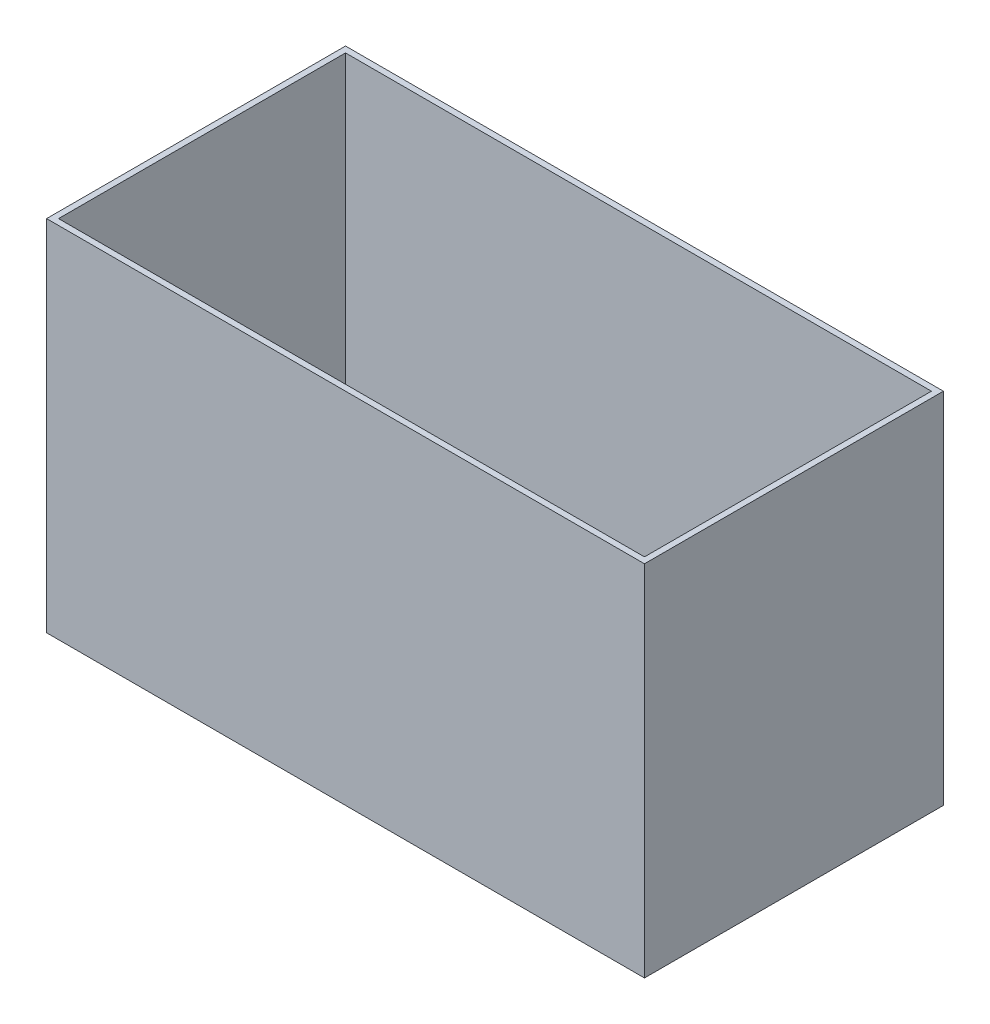
ISO-10303-21;
HEADER;
FILE_DESCRIPTION(('STEP AP214'),'2;1');
FILE_NAME('part.step','',(''),(''),'','','');
FILE_SCHEMA(('AUTOMOTIVE_DESIGN { 1 0 10303 214 1 1 1 1 }'));
ENDSEC;
DATA;
#1=APPLICATION_CONTEXT('core data for automotive mechanical design processes');
#2=APPLICATION_PROTOCOL_DEFINITION('international standard','automotive_design',2000,#1);
#3=PRODUCT_CONTEXT('',#1,'mechanical');
#4=PRODUCT('Part','Part','',(#3));
#5=PRODUCT_RELATED_PRODUCT_CATEGORY('part','',(#4));
#6=PRODUCT_DEFINITION_FORMATION('','',#4);
#7=PRODUCT_DEFINITION_CONTEXT('part definition',#1,'design');
#8=PRODUCT_DEFINITION('design','',#6,#7);
#9=PRODUCT_DEFINITION_SHAPE('','',#8);
#10=(LENGTH_UNIT() NAMED_UNIT(*) SI_UNIT(.MILLI.,.METRE.));
#11=(NAMED_UNIT(*) PLANE_ANGLE_UNIT() SI_UNIT($,.RADIAN.));
#12=(NAMED_UNIT(*) SI_UNIT($,.STERADIAN.) SOLID_ANGLE_UNIT());
#13=UNCERTAINTY_MEASURE_WITH_UNIT(LENGTH_MEASURE(1.E-05),#10,'distance_accuracy_value','');
#14=(GEOMETRIC_REPRESENTATION_CONTEXT(3) GLOBAL_UNCERTAINTY_ASSIGNED_CONTEXT((#13)) GLOBAL_UNIT_ASSIGNED_CONTEXT((#10,
#11,#12)) REPRESENTATION_CONTEXT('',''));
#15=CARTESIAN_POINT('',(0.,0.,0.));
#16=DIRECTION('',(0.,0.,1.));
#17=DIRECTION('',(1.,0.,0.));
#18=AXIS2_PLACEMENT_3D('',#15,#16,#17);
#19=CARTESIAN_POINT('',(0.,300.,0.));
#20=DIRECTION('',(0.,-1.,0.));
#21=DIRECTION('',(0.,0.,-1.));
#22=AXIS2_PLACEMENT_3D('',#19,#20,#21);
#23=PLANE('',#22);
#24=DIRECTION('',(0.,0.,1.));
#25=VECTOR('',#24,1.);
#26=CARTESIAN_POINT('',(0.,300.,0.));
#27=LINE('',#26,#25);
#28=CARTESIAN_POINT('',(0.,300.,-250.));
#29=VERTEX_POINT('',#28);
#30=CARTESIAN_POINT('',(0.,300.,0.));
#31=VERTEX_POINT('',#30);
#32=EDGE_CURVE('E141',#29,#31,#27,.T.);
#33=ORIENTED_EDGE('',*,*,#32,.T.);
#34=DIRECTION('',(1.,0.,0.));
#35=VECTOR('',#34,1.);
#36=CARTESIAN_POINT('',(0.,300.,0.));
#37=LINE('',#36,#35);
#38=CARTESIAN_POINT('',(500.,300.,0.));
#39=VERTEX_POINT('',#38);
#40=EDGE_CURVE('E85',#31,#39,#37,.T.);
#41=ORIENTED_EDGE('',*,*,#40,.T.);
#42=DIRECTION('',(0.,0.,-1.));
#43=VECTOR('',#42,1.);
#44=CARTESIAN_POINT('',(500.,300.,0.));
#45=LINE('',#44,#43);
#46=CARTESIAN_POINT('',(500.,300.,-250.));
#47=VERTEX_POINT('',#46);
#48=EDGE_CURVE('E144',#39,#47,#45,.T.);
#49=ORIENTED_EDGE('',*,*,#48,.T.);
#50=DIRECTION('',(-1.,0.,0.));
#51=VECTOR('',#50,1.);
#52=CARTESIAN_POINT('',(0.,300.,-250.));
#53=LINE('',#52,#51);
#54=EDGE_CURVE('E57',#47,#29,#53,.T.);
#55=ORIENTED_EDGE('',*,*,#54,.T.);
#56=EDGE_LOOP('',(#33,#41,#49,#55));
#57=FACE_BOUND('',#56,.T.);
#58=DIRECTION('',(0.,0.,1.));
#59=VECTOR('',#58,1.);
#60=CARTESIAN_POINT('',(5.,300.,0.));
#61=LINE('',#60,#59);
#62=CARTESIAN_POINT('',(5.,300.,-245.));
#63=VERTEX_POINT('',#62);
#64=CARTESIAN_POINT('',(5.,300.,-5.));
#65=VERTEX_POINT('',#64);
#66=EDGE_CURVE('E130',#63,#65,#61,.T.);
#67=ORIENTED_EDGE('',*,*,#66,.F.);
#68=DIRECTION('',(-1.,0.,0.));
#69=VECTOR('',#68,1.);
#70=CARTESIAN_POINT('',(0.,300.,-245.));
#71=LINE('',#70,#69);
#72=CARTESIAN_POINT('',(495.,300.,-245.));
#73=VERTEX_POINT('',#72);
#74=EDGE_CURVE('E139',#73,#63,#71,.T.);
#75=ORIENTED_EDGE('',*,*,#74,.F.);
#76=DIRECTION('',(0.,0.,-1.));
#77=VECTOR('',#76,1.);
#78=CARTESIAN_POINT('',(495.,300.,0.));
#79=LINE('',#78,#77);
#80=CARTESIAN_POINT('',(495.,300.,-5.));
#81=VERTEX_POINT('',#80);
#82=EDGE_CURVE('E137',#81,#73,#79,.T.);
#83=ORIENTED_EDGE('',*,*,#82,.F.);
#84=DIRECTION('',(1.,0.,0.));
#85=VECTOR('',#84,1.);
#86=CARTESIAN_POINT('',(0.,300.,-5.));
#87=LINE('',#86,#85);
#88=EDGE_CURVE('E122',#65,#81,#87,.T.);
#89=ORIENTED_EDGE('',*,*,#88,.F.);
#90=EDGE_LOOP('',(#67,#75,#83,#89));
#91=FACE_BOUND('',#90,.T.);
#92=ADVANCED_FACE('F33',(#57,#91),#23,.F.);
#93=CARTESIAN_POINT('',(0.,300.,0.));
#94=DIRECTION('',(1.,0.,0.));
#95=DIRECTION('',(0.,0.,-1.));
#96=AXIS2_PLACEMENT_3D('',#93,#94,#95);
#97=PLANE('',#96);
#98=DIRECTION('',(0.,0.,1.));
#99=VECTOR('',#98,1.);
#100=CARTESIAN_POINT('',(0.,0.,0.));
#101=LINE('',#100,#99);
#102=CARTESIAN_POINT('',(0.,0.,-250.));
#103=VERTEX_POINT('',#102);
#104=CARTESIAN_POINT('',(0.,0.,0.));
#105=VERTEX_POINT('',#104);
#106=EDGE_CURVE('E148',#103,#105,#101,.T.);
#107=ORIENTED_EDGE('',*,*,#106,.T.);
#108=DIRECTION('',(0.,-1.,0.));
#109=VECTOR('',#108,1.);
#110=CARTESIAN_POINT('',(0.,300.,0.));
#111=LINE('',#110,#109);
#112=EDGE_CURVE('E11',#31,#105,#111,.T.);
#113=ORIENTED_EDGE('',*,*,#112,.F.);
#114=ORIENTED_EDGE('',*,*,#32,.F.);
#115=DIRECTION('',(0.,-1.,0.));
#116=VECTOR('',#115,1.);
#117=CARTESIAN_POINT('',(0.,300.,-250.));
#118=LINE('',#117,#116);
#119=EDGE_CURVE('E147',#29,#103,#118,.T.);
#120=ORIENTED_EDGE('',*,*,#119,.T.);
#121=EDGE_LOOP('',(#107,#113,#114,#120));
#122=FACE_BOUND('',#121,.T.);
#123=ADVANCED_FACE('F35',(#122),#97,.F.);
#124=CARTESIAN_POINT('',(0.,300.,0.));
#125=DIRECTION('',(0.,0.,-1.));
#126=DIRECTION('',(-1.,0.,0.));
#127=AXIS2_PLACEMENT_3D('',#124,#125,#126);
#128=PLANE('',#127);
#129=DIRECTION('',(1.,0.,0.));
#130=VECTOR('',#129,1.);
#131=CARTESIAN_POINT('',(0.,0.,0.));
#132=LINE('',#131,#130);
#133=CARTESIAN_POINT('',(500.,0.,0.));
#134=VERTEX_POINT('',#133);
#135=EDGE_CURVE('E151',#105,#134,#132,.T.);
#136=ORIENTED_EDGE('',*,*,#135,.T.);
#137=DIRECTION('',(0.,-1.,0.));
#138=VECTOR('',#137,1.);
#139=CARTESIAN_POINT('',(500.,300.,0.));
#140=LINE('',#139,#138);
#141=EDGE_CURVE('E41',#39,#134,#140,.T.);
#142=ORIENTED_EDGE('',*,*,#141,.F.);
#143=ORIENTED_EDGE('',*,*,#40,.F.);
#144=ORIENTED_EDGE('',*,*,#112,.T.);
#145=EDGE_LOOP('',(#136,#142,#143,#144));
#146=FACE_BOUND('',#145,.T.);
#147=ADVANCED_FACE('F179',(#146),#128,.F.);
#148=CARTESIAN_POINT('',(500.,300.,0.));
#149=DIRECTION('',(-1.,0.,0.));
#150=DIRECTION('',(0.,0.,1.));
#151=AXIS2_PLACEMENT_3D('',#148,#149,#150);
#152=PLANE('',#151);
#153=DIRECTION('',(0.,0.,-1.));
#154=VECTOR('',#153,1.);
#155=CARTESIAN_POINT('',(500.,0.,0.));
#156=LINE('',#155,#154);
#157=CARTESIAN_POINT('',(500.,0.,-250.));
#158=VERTEX_POINT('',#157);
#159=EDGE_CURVE('E153',#134,#158,#156,.T.);
#160=ORIENTED_EDGE('',*,*,#159,.T.);
#161=DIRECTION('',(0.,-1.,0.));
#162=VECTOR('',#161,1.);
#163=CARTESIAN_POINT('',(500.,300.,-250.));
#164=LINE('',#163,#162);
#165=EDGE_CURVE('E157',#47,#158,#164,.T.);
#166=ORIENTED_EDGE('',*,*,#165,.F.);
#167=ORIENTED_EDGE('',*,*,#48,.F.);
#168=ORIENTED_EDGE('',*,*,#141,.T.);
#169=EDGE_LOOP('',(#160,#166,#167,#168));
#170=FACE_BOUND('',#169,.T.);
#171=ADVANCED_FACE('F162',(#170),#152,.F.);
#172=CARTESIAN_POINT('',(0.,300.,-250.));
#173=DIRECTION('',(0.,0.,1.));
#174=DIRECTION('',(1.,0.,0.));
#175=AXIS2_PLACEMENT_3D('',#172,#173,#174);
#176=PLANE('',#175);
#177=DIRECTION('',(-1.,0.,0.));
#178=VECTOR('',#177,1.);
#179=CARTESIAN_POINT('',(0.,0.,-250.));
#180=LINE('',#179,#178);
#181=EDGE_CURVE('E78',#158,#103,#180,.T.);
#182=ORIENTED_EDGE('',*,*,#181,.T.);
#183=ORIENTED_EDGE('',*,*,#119,.F.);
#184=ORIENTED_EDGE('',*,*,#54,.F.);
#185=ORIENTED_EDGE('',*,*,#165,.T.);
#186=EDGE_LOOP('',(#182,#183,#184,#185));
#187=FACE_BOUND('',#186,.T.);
#188=ADVANCED_FACE('F170',(#187),#176,.F.);
#189=CARTESIAN_POINT('',(0.,0.,0.));
#190=DIRECTION('',(0.,-1.,0.));
#191=DIRECTION('',(0.,0.,-1.));
#192=AXIS2_PLACEMENT_3D('',#189,#190,#191);
#193=PLANE('',#192);
#194=ORIENTED_EDGE('',*,*,#106,.F.);
#195=ORIENTED_EDGE('',*,*,#181,.F.);
#196=ORIENTED_EDGE('',*,*,#159,.F.);
#197=ORIENTED_EDGE('',*,*,#135,.F.);
#198=EDGE_LOOP('',(#194,#195,#196,#197));
#199=FACE_BOUND('',#198,.T.);
#200=ADVANCED_FACE('F166',(#199),#193,.T.);
#201=CARTESIAN_POINT('',(5.,300.,0.));
#202=DIRECTION('',(1.,0.,0.));
#203=DIRECTION('',(0.,0.,-1.));
#204=AXIS2_PLACEMENT_3D('',#201,#202,#203);
#205=PLANE('',#204);
#206=DIRECTION('',(0.,0.,1.));
#207=VECTOR('',#206,1.);
#208=CARTESIAN_POINT('',(5.,5.,0.));
#209=LINE('',#208,#207);
#210=CARTESIAN_POINT('',(5.,5.,-245.));
#211=VERTEX_POINT('',#210);
#212=CARTESIAN_POINT('',(5.,5.,-5.));
#213=VERTEX_POINT('',#212);
#214=EDGE_CURVE('E113',#211,#213,#209,.T.);
#215=ORIENTED_EDGE('',*,*,#214,.F.);
#216=DIRECTION('',(0.,-1.,0.));
#217=VECTOR('',#216,1.);
#218=CARTESIAN_POINT('',(5.,300.,-245.));
#219=LINE('',#218,#217);
#220=EDGE_CURVE('E133',#63,#211,#219,.T.);
#221=ORIENTED_EDGE('',*,*,#220,.F.);
#222=ORIENTED_EDGE('',*,*,#66,.T.);
#223=DIRECTION('',(0.,-1.,0.));
#224=VECTOR('',#223,1.);
#225=CARTESIAN_POINT('',(5.,300.,-5.));
#226=LINE('',#225,#224);
#227=EDGE_CURVE('E125',#65,#213,#226,.T.);
#228=ORIENTED_EDGE('',*,*,#227,.T.);
#229=EDGE_LOOP('',(#215,#221,#222,#228));
#230=FACE_BOUND('',#229,.T.);
#231=ADVANCED_FACE('F177',(#230),#205,.T.);
#232=CARTESIAN_POINT('',(0.,300.,-5.));
#233=DIRECTION('',(0.,0.,-1.));
#234=DIRECTION('',(-1.,0.,0.));
#235=AXIS2_PLACEMENT_3D('',#232,#233,#234);
#236=PLANE('',#235);
#237=DIRECTION('',(1.,0.,0.));
#238=VECTOR('',#237,1.);
#239=CARTESIAN_POINT('',(0.,5.,-5.));
#240=LINE('',#239,#238);
#241=CARTESIAN_POINT('',(495.,5.,-5.));
#242=VERTEX_POINT('',#241);
#243=EDGE_CURVE('E107',#213,#242,#240,.T.);
#244=ORIENTED_EDGE('',*,*,#243,.F.);
#245=ORIENTED_EDGE('',*,*,#227,.F.);
#246=ORIENTED_EDGE('',*,*,#88,.T.);
#247=DIRECTION('',(0.,-1.,0.));
#248=VECTOR('',#247,1.);
#249=CARTESIAN_POINT('',(495.,300.,-5.));
#250=LINE('',#249,#248);
#251=EDGE_CURVE('E119',#81,#242,#250,.T.);
#252=ORIENTED_EDGE('',*,*,#251,.T.);
#253=EDGE_LOOP('',(#244,#245,#246,#252));
#254=FACE_BOUND('',#253,.T.);
#255=ADVANCED_FACE('F120',(#254),#236,.T.);
#256=CARTESIAN_POINT('',(495.,300.,0.));
#257=DIRECTION('',(-1.,0.,0.));
#258=DIRECTION('',(0.,0.,1.));
#259=AXIS2_PLACEMENT_3D('',#256,#257,#258);
#260=PLANE('',#259);
#261=DIRECTION('',(0.,0.,-1.));
#262=VECTOR('',#261,1.);
#263=CARTESIAN_POINT('',(495.,5.,0.));
#264=LINE('',#263,#262);
#265=CARTESIAN_POINT('',(495.,5.,-245.));
#266=VERTEX_POINT('',#265);
#267=EDGE_CURVE('E111',#242,#266,#264,.T.);
#268=ORIENTED_EDGE('',*,*,#267,.F.);
#269=ORIENTED_EDGE('',*,*,#251,.F.);
#270=ORIENTED_EDGE('',*,*,#82,.T.);
#271=DIRECTION('',(0.,-1.,0.));
#272=VECTOR('',#271,1.);
#273=CARTESIAN_POINT('',(495.,300.,-245.));
#274=LINE('',#273,#272);
#275=EDGE_CURVE('E48',#73,#266,#274,.T.);
#276=ORIENTED_EDGE('',*,*,#275,.T.);
#277=EDGE_LOOP('',(#268,#269,#270,#276));
#278=FACE_BOUND('',#277,.T.);
#279=ADVANCED_FACE('F127',(#278),#260,.T.);
#280=CARTESIAN_POINT('',(0.,300.,-245.));
#281=DIRECTION('',(0.,0.,1.));
#282=DIRECTION('',(1.,0.,0.));
#283=AXIS2_PLACEMENT_3D('',#280,#281,#282);
#284=PLANE('',#283);
#285=DIRECTION('',(-1.,0.,0.));
#286=VECTOR('',#285,1.);
#287=CARTESIAN_POINT('',(0.,5.,-245.));
#288=LINE('',#287,#286);
#289=EDGE_CURVE('E128',#266,#211,#288,.T.);
#290=ORIENTED_EDGE('',*,*,#289,.F.);
#291=ORIENTED_EDGE('',*,*,#275,.F.);
#292=ORIENTED_EDGE('',*,*,#74,.T.);
#293=ORIENTED_EDGE('',*,*,#220,.T.);
#294=EDGE_LOOP('',(#290,#291,#292,#293));
#295=FACE_BOUND('',#294,.T.);
#296=ADVANCED_FACE('F190',(#295),#284,.T.);
#297=CARTESIAN_POINT('',(0.,5.,0.));
#298=DIRECTION('',(0.,-1.,0.));
#299=DIRECTION('',(0.,0.,-1.));
#300=AXIS2_PLACEMENT_3D('',#297,#298,#299);
#301=PLANE('',#300);
#302=ORIENTED_EDGE('',*,*,#214,.T.);
#303=ORIENTED_EDGE('',*,*,#243,.T.);
#304=ORIENTED_EDGE('',*,*,#267,.T.);
#305=ORIENTED_EDGE('',*,*,#289,.T.);
#306=EDGE_LOOP('',(#302,#303,#304,#305));
#307=FACE_BOUND('',#306,.T.);
#308=ADVANCED_FACE('F109',(#307),#301,.F.);
#309=CLOSED_SHELL('',(#92,#123,#147,#171,#188,#200,#231,#255,#279,#296,#308));
#310=MANIFOLD_SOLID_BREP('B2',#309);
#311=ADVANCED_BREP_SHAPE_REPRESENTATION('',(#18,#310),#14);
#312=SHAPE_DEFINITION_REPRESENTATION(#9,#311);
ENDSEC;
END-ISO-10303-21;
